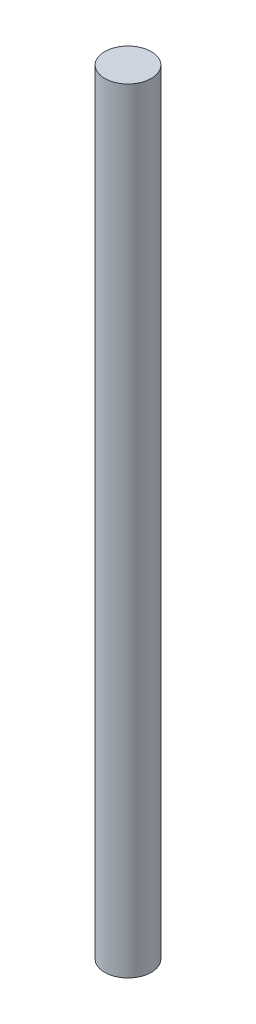
ISO-10303-21;
HEADER;
FILE_DESCRIPTION(('STEP AP214'),'2;1');
FILE_NAME('part.step','',(''),(''),'','','');
FILE_SCHEMA(('AUTOMOTIVE_DESIGN { 1 0 10303 214 1 1 1 1 }'));
ENDSEC;
DATA;
#1=APPLICATION_CONTEXT('core data for automotive mechanical design processes');
#2=APPLICATION_PROTOCOL_DEFINITION('international standard','automotive_design',2000,#1);
#3=PRODUCT_CONTEXT('',#1,'mechanical');
#4=PRODUCT('Part','Part','',(#3));
#5=PRODUCT_RELATED_PRODUCT_CATEGORY('part','',(#4));
#6=PRODUCT_DEFINITION_FORMATION('','',#4);
#7=PRODUCT_DEFINITION_CONTEXT('part definition',#1,'design');
#8=PRODUCT_DEFINITION('design','',#6,#7);
#9=PRODUCT_DEFINITION_SHAPE('','',#8);
#10=(LENGTH_UNIT() NAMED_UNIT(*) SI_UNIT(.MILLI.,.METRE.));
#11=(NAMED_UNIT(*) PLANE_ANGLE_UNIT() SI_UNIT($,.RADIAN.));
#12=(NAMED_UNIT(*) SI_UNIT($,.STERADIAN.) SOLID_ANGLE_UNIT());
#13=UNCERTAINTY_MEASURE_WITH_UNIT(LENGTH_MEASURE(1.E-05),#10,'distance_accuracy_value','');
#14=(GEOMETRIC_REPRESENTATION_CONTEXT(3) GLOBAL_UNCERTAINTY_ASSIGNED_CONTEXT((#13)) GLOBAL_UNIT_ASSIGNED_CONTEXT((#10,
#11,#12)) REPRESENTATION_CONTEXT('',''));
#15=CARTESIAN_POINT('',(0.,0.,0.));
#16=DIRECTION('',(0.,0.,1.));
#17=DIRECTION('',(1.,0.,0.));
#18=AXIS2_PLACEMENT_3D('',#15,#16,#17);
#19=CARTESIAN_POINT('',(0.,1164.,0.));
#20=DIRECTION('',(0.,-1.,0.));
#21=DIRECTION('',(0.,0.,-1.));
#22=AXIS2_PLACEMENT_3D('',#19,#20,#21);
#23=CYLINDRICAL_SURFACE('',#22,35.);
#24=CARTESIAN_POINT('',(0.,1164.,0.));
#25=DIRECTION('',(0.,1.,0.));
#26=DIRECTION('',(0.,0.,1.));
#27=AXIS2_PLACEMENT_3D('',#24,#25,#26);
#28=CIRCLE('',#27,35.);
#29=CARTESIAN_POINT('',(0.,1164.,35.));
#30=VERTEX_POINT('',#29);
#31=EDGE_CURVE('E10',#30,#30,#28,.T.);
#32=ORIENTED_EDGE('',*,*,#31,.F.);
#33=EDGE_LOOP('',(#32));
#34=FACE_BOUND('',#33,.T.);
#35=CARTESIAN_POINT('',(0.,0.,0.));
#36=DIRECTION('',(0.,1.,0.));
#37=DIRECTION('',(0.,0.,1.));
#38=AXIS2_PLACEMENT_3D('',#35,#36,#37);
#39=CIRCLE('',#38,35.);
#40=CARTESIAN_POINT('',(0.,0.,35.));
#41=VERTEX_POINT('',#40);
#42=EDGE_CURVE('E40',#41,#41,#39,.T.);
#43=ORIENTED_EDGE('',*,*,#42,.T.);
#44=EDGE_LOOP('',(#43));
#45=FACE_BOUND('',#44,.T.);
#46=ADVANCED_FACE('F37',(#34,#45),#23,.T.);
#47=CARTESIAN_POINT('',(0.,1164.,0.));
#48=DIRECTION('',(0.,1.,0.));
#49=DIRECTION('',(0.,0.,1.));
#50=AXIS2_PLACEMENT_3D('',#47,#48,#49);
#51=PLANE('',#50);
#52=ORIENTED_EDGE('',*,*,#31,.T.);
#53=EDGE_LOOP('',(#52));
#54=FACE_BOUND('',#53,.T.);
#55=ADVANCED_FACE('F52',(#54),#51,.T.);
#56=CARTESIAN_POINT('',(0.,0.,0.));
#57=DIRECTION('',(0.,1.,0.));
#58=DIRECTION('',(0.,0.,1.));
#59=AXIS2_PLACEMENT_3D('',#56,#57,#58);
#60=PLANE('',#59);
#61=ORIENTED_EDGE('',*,*,#42,.F.);
#62=EDGE_LOOP('',(#61));
#63=FACE_BOUND('',#62,.T.);
#64=ADVANCED_FACE('F50',(#63),#60,.F.);
#65=CLOSED_SHELL('',(#46,#55,#64));
#66=MANIFOLD_SOLID_BREP('B2',#65);
#67=ADVANCED_BREP_SHAPE_REPRESENTATION('',(#18,#66),#14);
#68=SHAPE_DEFINITION_REPRESENTATION(#9,#67);
ENDSEC;
END-ISO-10303-21;
